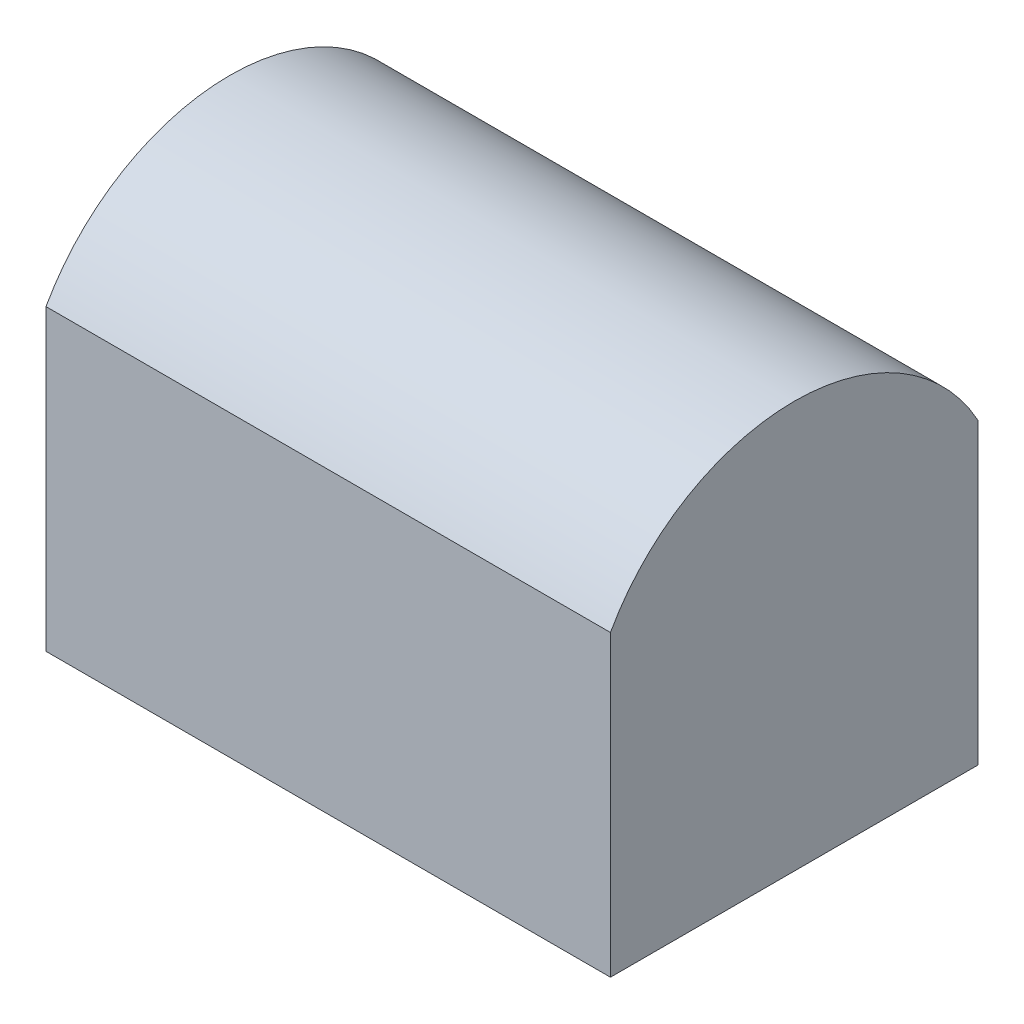
ISO-10303-21;
HEADER;
FILE_DESCRIPTION(('STEP AP214'),'2;1');
FILE_NAME('part.step','',(''),(''),'','','');
FILE_SCHEMA(('AUTOMOTIVE_DESIGN { 1 0 10303 214 1 1 1 1 }'));
ENDSEC;
DATA;
#1=APPLICATION_CONTEXT('core data for automotive mechanical design processes');
#2=APPLICATION_PROTOCOL_DEFINITION('international standard','automotive_design',2000,#1);
#3=PRODUCT_CONTEXT('',#1,'mechanical');
#4=PRODUCT('Part','Part','',(#3));
#5=PRODUCT_RELATED_PRODUCT_CATEGORY('part','',(#4));
#6=PRODUCT_DEFINITION_FORMATION('','',#4);
#7=PRODUCT_DEFINITION_CONTEXT('part definition',#1,'design');
#8=PRODUCT_DEFINITION('design','',#6,#7);
#9=PRODUCT_DEFINITION_SHAPE('','',#8);
#10=(LENGTH_UNIT() NAMED_UNIT(*) SI_UNIT(.MILLI.,.METRE.));
#11=(NAMED_UNIT(*) PLANE_ANGLE_UNIT() SI_UNIT($,.RADIAN.));
#12=(NAMED_UNIT(*) SI_UNIT($,.STERADIAN.) SOLID_ANGLE_UNIT());
#13=UNCERTAINTY_MEASURE_WITH_UNIT(LENGTH_MEASURE(1.E-05),#10,'distance_accuracy_value','');
#14=(GEOMETRIC_REPRESENTATION_CONTEXT(3) GLOBAL_UNCERTAINTY_ASSIGNED_CONTEXT((#13)) GLOBAL_UNIT_ASSIGNED_CONTEXT((#10,
#11,#12)) REPRESENTATION_CONTEXT('',''));
#15=CARTESIAN_POINT('',(0.,0.,0.));
#16=DIRECTION('',(0.,0.,1.));
#17=DIRECTION('',(1.,0.,0.));
#18=AXIS2_PLACEMENT_3D('',#15,#16,#17);
#19=CARTESIAN_POINT('',(-2.15000000000004,0.,1.39999999999999));
#20=DIRECTION('',(0.,1.,0.));
#21=DIRECTION('',(0.,0.,1.));
#22=AXIS2_PLACEMENT_3D('',#19,#20,#21);
#23=PLANE('',#22);
#24=DIRECTION('',(0.,0.,-1.));
#25=VECTOR('',#24,1.);
#26=CARTESIAN_POINT('',(-2.15000000000004,0.,1.39999999999999));
#27=LINE('',#26,#25);
#28=CARTESIAN_POINT('',(-2.15000000000004,0.,1.39999999999999));
#29=VERTEX_POINT('',#28);
#30=CARTESIAN_POINT('',(-2.15000000000004,0.,-1.39999999999999));
#31=VERTEX_POINT('',#30);
#32=EDGE_CURVE('E60',#29,#31,#27,.T.);
#33=ORIENTED_EDGE('',*,*,#32,.T.);
#34=DIRECTION('',(1.,0.,0.));
#35=VECTOR('',#34,1.);
#36=CARTESIAN_POINT('',(-2.15000000000004,0.,-1.39999999999999));
#37=LINE('',#36,#35);
#38=CARTESIAN_POINT('',(2.15000000000004,0.,-1.39999999999999));
#39=VERTEX_POINT('',#38);
#40=EDGE_CURVE('E62',#31,#39,#37,.T.);
#41=ORIENTED_EDGE('',*,*,#40,.T.);
#42=DIRECTION('',(0.,0.,1.));
#43=VECTOR('',#42,1.);
#44=CARTESIAN_POINT('',(2.15000000000004,0.,1.39999999999999));
#45=LINE('',#44,#43);
#46=CARTESIAN_POINT('',(2.15000000000004,0.,1.39999999999999));
#47=VERTEX_POINT('',#46);
#48=EDGE_CURVE('E54',#39,#47,#45,.T.);
#49=ORIENTED_EDGE('',*,*,#48,.T.);
#50=DIRECTION('',(1.,0.,0.));
#51=VECTOR('',#50,1.);
#52=CARTESIAN_POINT('',(-2.15000000000004,0.,1.39999999999999));
#53=LINE('',#52,#51);
#54=EDGE_CURVE('E65',#29,#47,#53,.T.);
#55=ORIENTED_EDGE('',*,*,#54,.F.);
#56=EDGE_LOOP('',(#33,#41,#49,#55));
#57=FACE_BOUND('',#56,.T.);
#58=ADVANCED_FACE('F16',(#57),#23,.F.);
#59=CARTESIAN_POINT('',(2.15000000000004,3.1000000000003,1.39999999999999));
#60=DIRECTION('',(-1.,0.,0.));
#61=DIRECTION('',(0.,0.,1.));
#62=AXIS2_PLACEMENT_3D('',#59,#60,#61);
#63=PLANE('',#62);
#64=ORIENTED_EDGE('',*,*,#48,.F.);
#65=DIRECTION('',(0.,1.,0.));
#66=VECTOR('',#65,1.);
#67=CARTESIAN_POINT('',(2.15000000000004,0.,-1.39999999999999));
#68=LINE('',#67,#66);
#69=CARTESIAN_POINT('',(2.15000000000004,2.27459666924152,-1.39999999999998));
#70=VERTEX_POINT('',#69);
#71=EDGE_CURVE('E72',#39,#70,#68,.T.);
#72=ORIENTED_EDGE('',*,*,#71,.T.);
#73=CARTESIAN_POINT('',(2.15000000000004,1.5000000000001,0.));
#74=DIRECTION('',(1.,0.,0.));
#75=DIRECTION('',(0.,0.,-1.));
#76=AXIS2_PLACEMENT_3D('',#73,#74,#75);
#77=CIRCLE('',#76,1.59999999999995);
#78=CARTESIAN_POINT('',(2.15000000000004,2.27459666924152,1.39999999999998));
#79=VERTEX_POINT('',#78);
#80=EDGE_CURVE('E19',#79,#70,#77,.F.);
#81=ORIENTED_EDGE('',*,*,#80,.F.);
#82=DIRECTION('',(0.,1.,0.));
#83=VECTOR('',#82,1.);
#84=CARTESIAN_POINT('',(2.15000000000004,0.,1.39999999999999));
#85=LINE('',#84,#83);
#86=EDGE_CURVE('E78',#47,#79,#85,.T.);
#87=ORIENTED_EDGE('',*,*,#86,.F.);
#88=EDGE_LOOP('',(#64,#72,#81,#87));
#89=FACE_BOUND('',#88,.T.);
#90=ADVANCED_FACE('F106',(#89),#63,.F.);
#91=CARTESIAN_POINT('',(-2.15000000000004,0.,-1.39999999999999));
#92=DIRECTION('',(0.,0.,1.));
#93=DIRECTION('',(1.,0.,0.));
#94=AXIS2_PLACEMENT_3D('',#91,#92,#93);
#95=PLANE('',#94);
#96=DIRECTION('',(0.,1.,0.));
#97=VECTOR('',#96,1.);
#98=CARTESIAN_POINT('',(-2.15000000000004,3.1000000000003,-1.39999999999999));
#99=LINE('',#98,#97);
#100=CARTESIAN_POINT('',(-2.15000000000004,2.27459666924152,-1.39999999999998));
#101=VERTEX_POINT('',#100);
#102=EDGE_CURVE('E67',#31,#101,#99,.T.);
#103=ORIENTED_EDGE('',*,*,#102,.T.);
#104=DIRECTION('',(1.,0.,0.));
#105=VECTOR('',#104,1.);
#106=CARTESIAN_POINT('',(-2.15000000000004,2.27459666924154,-1.39999999999996));
#107=LINE('',#106,#105);
#108=EDGE_CURVE('E83',#70,#101,#107,.F.);
#109=ORIENTED_EDGE('',*,*,#108,.F.);
#110=ORIENTED_EDGE('',*,*,#71,.F.);
#111=ORIENTED_EDGE('',*,*,#40,.F.);
#112=EDGE_LOOP('',(#103,#109,#110,#111));
#113=FACE_BOUND('',#112,.T.);
#114=ADVANCED_FACE('F70',(#113),#95,.F.);
#115=CARTESIAN_POINT('',(-2.15000000000004,3.1000000000003,1.39999999999999));
#116=DIRECTION('',(1.,0.,0.));
#117=DIRECTION('',(0.,0.,-1.));
#118=AXIS2_PLACEMENT_3D('',#115,#116,#117);
#119=PLANE('',#118);
#120=ORIENTED_EDGE('',*,*,#102,.F.);
#121=ORIENTED_EDGE('',*,*,#32,.F.);
#122=DIRECTION('',(0.,1.,0.));
#123=VECTOR('',#122,1.);
#124=CARTESIAN_POINT('',(-2.15000000000004,0.,1.39999999999999));
#125=LINE('',#124,#123);
#126=CARTESIAN_POINT('',(-2.15000000000004,2.27459666924152,1.39999999999998));
#127=VERTEX_POINT('',#126);
#128=EDGE_CURVE('E34',#127,#29,#125,.F.);
#129=ORIENTED_EDGE('',*,*,#128,.F.);
#130=CARTESIAN_POINT('',(-2.15000000000004,1.5000000000001,0.));
#131=DIRECTION('',(1.,0.,0.));
#132=DIRECTION('',(0.,0.,-1.));
#133=AXIS2_PLACEMENT_3D('',#130,#131,#132);
#134=CIRCLE('',#133,1.59999999999995);
#135=EDGE_CURVE('E25',#101,#127,#134,.T.);
#136=ORIENTED_EDGE('',*,*,#135,.F.);
#137=EDGE_LOOP('',(#120,#121,#129,#136));
#138=FACE_BOUND('',#137,.T.);
#139=ADVANCED_FACE('F74',(#138),#119,.F.);
#140=CARTESIAN_POINT('',(-2.15000000000004,0.,1.39999999999999));
#141=DIRECTION('',(0.,0.,1.));
#142=DIRECTION('',(1.,0.,0.));
#143=AXIS2_PLACEMENT_3D('',#140,#141,#142);
#144=PLANE('',#143);
#145=DIRECTION('',(1.,0.,0.));
#146=VECTOR('',#145,1.);
#147=CARTESIAN_POINT('',(-2.15000000000004,2.27459666924154,1.39999999999996));
#148=LINE('',#147,#146);
#149=EDGE_CURVE('E11',#127,#79,#148,.T.);
#150=ORIENTED_EDGE('',*,*,#149,.F.);
#151=ORIENTED_EDGE('',*,*,#128,.T.);
#152=ORIENTED_EDGE('',*,*,#54,.T.);
#153=ORIENTED_EDGE('',*,*,#86,.T.);
#154=EDGE_LOOP('',(#150,#151,#152,#153));
#155=FACE_BOUND('',#154,.T.);
#156=ADVANCED_FACE('F105',(#155),#144,.T.);
#157=CARTESIAN_POINT('',(-2.15000000000004,1.5000000000001,0.));
#158=DIRECTION('',(1.,0.,0.));
#159=DIRECTION('',(0.,0.,-1.));
#160=AXIS2_PLACEMENT_3D('',#157,#158,#159);
#161=CYLINDRICAL_SURFACE('',#160,1.59999999999995);
#162=ORIENTED_EDGE('',*,*,#135,.T.);
#163=ORIENTED_EDGE('',*,*,#149,.T.);
#164=ORIENTED_EDGE('',*,*,#80,.T.);
#165=ORIENTED_EDGE('',*,*,#108,.T.);
#166=EDGE_LOOP('',(#162,#163,#164,#165));
#167=FACE_BOUND('',#166,.T.);
#168=ADVANCED_FACE('F103',(#167),#161,.T.);
#169=CLOSED_SHELL('',(#58,#90,#114,#139,#156,#168));
#170=MANIFOLD_SOLID_BREP('B1',#169);
#171=ADVANCED_BREP_SHAPE_REPRESENTATION('',(#18,#170),#14);
#172=SHAPE_DEFINITION_REPRESENTATION(#9,#171);
ENDSEC;
END-ISO-10303-21;
